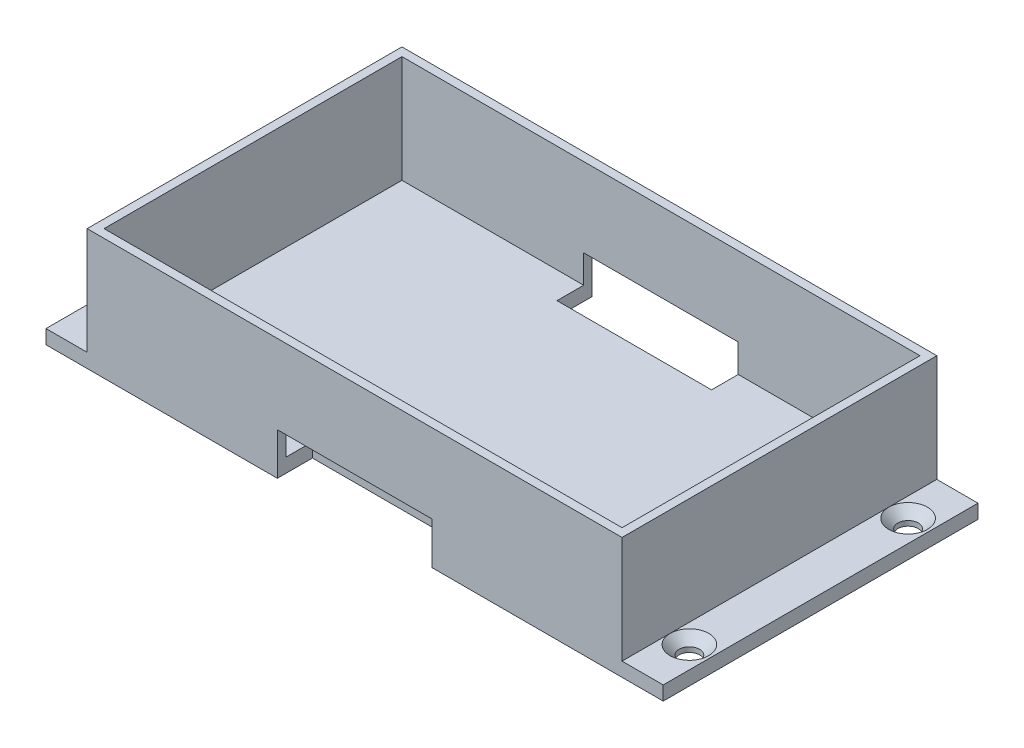
ISO-10303-21;
HEADER;
FILE_DESCRIPTION(('STEP AP214'),'2;1');
FILE_NAME('part.step','',(''),(''),'','','');
FILE_SCHEMA(('AUTOMOTIVE_DESIGN { 1 0 10303 214 1 1 1 1 }'));
ENDSEC;
DATA;
#1=APPLICATION_CONTEXT('core data for automotive mechanical design processes');
#2=APPLICATION_PROTOCOL_DEFINITION('international standard','automotive_design',2000,#1);
#3=PRODUCT_CONTEXT('',#1,'mechanical');
#4=PRODUCT('Part','Part','',(#3));
#5=PRODUCT_RELATED_PRODUCT_CATEGORY('part','',(#4));
#6=PRODUCT_DEFINITION_FORMATION('','',#4);
#7=PRODUCT_DEFINITION_CONTEXT('part definition',#1,'design');
#8=PRODUCT_DEFINITION('design','',#6,#7);
#9=PRODUCT_DEFINITION_SHAPE('','',#8);
#10=(LENGTH_UNIT() NAMED_UNIT(*) SI_UNIT(.MILLI.,.METRE.));
#11=(NAMED_UNIT(*) PLANE_ANGLE_UNIT() SI_UNIT($,.RADIAN.));
#12=(NAMED_UNIT(*) SI_UNIT($,.STERADIAN.) SOLID_ANGLE_UNIT());
#13=UNCERTAINTY_MEASURE_WITH_UNIT(LENGTH_MEASURE(1.E-05),#10,'distance_accuracy_value','');
#14=(GEOMETRIC_REPRESENTATION_CONTEXT(3) GLOBAL_UNCERTAINTY_ASSIGNED_CONTEXT((#13)) GLOBAL_UNIT_ASSIGNED_CONTEXT((#10,
#11,#12)) REPRESENTATION_CONTEXT('',''));
#15=CARTESIAN_POINT('',(0.,0.,0.));
#16=DIRECTION('',(0.,0.,1.));
#17=DIRECTION('',(1.,0.,0.));
#18=AXIS2_PLACEMENT_3D('',#15,#16,#17);
#19=CARTESIAN_POINT('',(-43.93,2.,-22.405));
#20=DIRECTION('',(0.,0.,1.));
#21=DIRECTION('',(1.,0.,0.));
#22=AXIS2_PLACEMENT_3D('',#19,#20,#21);
#23=PLANE('',#22);
#24=DIRECTION('',(0.,1.,0.));
#25=VECTOR('',#24,1.);
#26=CARTESIAN_POINT('',(-11.,2.,-22.405));
#27=LINE('',#26,#25);
#28=CARTESIAN_POINT('',(-11.,0.,-22.405));
#29=VERTEX_POINT('',#28);
#30=CARTESIAN_POINT('',(-11.,6.,-22.405));
#31=VERTEX_POINT('',#30);
#32=EDGE_CURVE('E268',#29,#31,#27,.T.);
#33=ORIENTED_EDGE('',*,*,#32,.F.);
#34=DIRECTION('',(-1.,0.,0.));
#35=VECTOR('',#34,1.);
#36=CARTESIAN_POINT('',(-43.93,0.,-22.405));
#37=LINE('',#36,#35);
#38=CARTESIAN_POINT('',(-43.93,0.,-22.405));
#39=VERTEX_POINT('',#38);
#40=EDGE_CURVE('E395',#29,#39,#37,.T.);
#41=ORIENTED_EDGE('',*,*,#40,.T.);
#42=DIRECTION('',(0.,-1.,0.));
#43=VECTOR('',#42,1.);
#44=CARTESIAN_POINT('',(-43.93,2.,-22.405));
#45=LINE('',#44,#43);
#46=CARTESIAN_POINT('',(-43.93,2.,-22.405));
#47=VERTEX_POINT('',#46);
#48=EDGE_CURVE('E409',#47,#39,#45,.T.);
#49=ORIENTED_EDGE('',*,*,#48,.F.);
#50=DIRECTION('',(-1.,0.,0.));
#51=VECTOR('',#50,1.);
#52=CARTESIAN_POINT('',(-43.93,2.,-22.405));
#53=LINE('',#52,#51);
#54=CARTESIAN_POINT('',(-38.07,2.,-22.405));
#55=VERTEX_POINT('',#54);
#56=EDGE_CURVE('E383',#55,#47,#53,.T.);
#57=ORIENTED_EDGE('',*,*,#56,.F.);
#58=DIRECTION('',(0.,-1.,0.));
#59=VECTOR('',#58,1.);
#60=CARTESIAN_POINT('',(-38.07,17.25,-22.405));
#61=LINE('',#60,#59);
#62=CARTESIAN_POINT('',(-38.07,17.25,-22.405));
#63=VERTEX_POINT('',#62);
#64=EDGE_CURVE('E331',#63,#55,#61,.T.);
#65=ORIENTED_EDGE('',*,*,#64,.F.);
#66=DIRECTION('',(-1.,0.,0.));
#67=VECTOR('',#66,1.);
#68=CARTESIAN_POINT('',(-38.07,17.25,-22.405));
#69=LINE('',#68,#67);
#70=CARTESIAN_POINT('',(38.07,17.25,-22.405));
#71=VERTEX_POINT('',#70);
#72=EDGE_CURVE('E328',#71,#63,#69,.T.);
#73=ORIENTED_EDGE('',*,*,#72,.F.);
#74=DIRECTION('',(0.,-1.,0.));
#75=VECTOR('',#74,1.);
#76=CARTESIAN_POINT('',(38.07,17.25,-22.405));
#77=LINE('',#76,#75);
#78=CARTESIAN_POINT('',(38.07,2.,-22.405));
#79=VERTEX_POINT('',#78);
#80=EDGE_CURVE('E293',#71,#79,#77,.T.);
#81=ORIENTED_EDGE('',*,*,#80,.T.);
#82=CARTESIAN_POINT('',(43.93,2.,-22.405));
#83=VERTEX_POINT('',#82);
#84=EDGE_CURVE('E385',#83,#79,#53,.T.);
#85=ORIENTED_EDGE('',*,*,#84,.F.);
#86=DIRECTION('',(0.,-1.,0.));
#87=VECTOR('',#86,1.);
#88=CARTESIAN_POINT('',(43.93,2.,-22.405));
#89=LINE('',#88,#87);
#90=CARTESIAN_POINT('',(43.93,0.,-22.405));
#91=VERTEX_POINT('',#90);
#92=EDGE_CURVE('E412',#83,#91,#89,.T.);
#93=ORIENTED_EDGE('',*,*,#92,.T.);
#94=CARTESIAN_POINT('',(11.,0.,-22.405));
#95=VERTEX_POINT('',#94);
#96=EDGE_CURVE('E396',#91,#95,#37,.T.);
#97=ORIENTED_EDGE('',*,*,#96,.T.);
#98=DIRECTION('',(0.,-1.,0.));
#99=VECTOR('',#98,1.);
#100=CARTESIAN_POINT('',(11.,2.,-22.405));
#101=LINE('',#100,#99);
#102=CARTESIAN_POINT('',(11.,6.,-22.405));
#103=VERTEX_POINT('',#102);
#104=EDGE_CURVE('E280',#103,#95,#101,.T.);
#105=ORIENTED_EDGE('',*,*,#104,.F.);
#106=DIRECTION('',(1.,0.,0.));
#107=VECTOR('',#106,1.);
#108=CARTESIAN_POINT('',(-43.93,6.,-22.405));
#109=LINE('',#108,#107);
#110=EDGE_CURVE('E274',#31,#103,#109,.T.);
#111=ORIENTED_EDGE('',*,*,#110,.F.);
#112=EDGE_LOOP('',(#33,#41,#49,#57,#65,#73,#81,#85,#93,#97,#105,#111));
#113=FACE_BOUND('',#112,.T.);
#114=ADVANCED_FACE('F39',(#113),#23,.F.);
#115=CARTESIAN_POINT('',(-43.93,2.,22.405));
#116=DIRECTION('',(0.,0.,-1.));
#117=DIRECTION('',(-1.,0.,0.));
#118=AXIS2_PLACEMENT_3D('',#115,#116,#117);
#119=PLANE('',#118);
#120=DIRECTION('',(1.,0.,0.));
#121=VECTOR('',#120,1.);
#122=CARTESIAN_POINT('',(-43.93,0.,22.405));
#123=LINE('',#122,#121);
#124=CARTESIAN_POINT('',(-43.93,0.,22.405));
#125=VERTEX_POINT('',#124);
#126=CARTESIAN_POINT('',(-11.,0.,22.405));
#127=VERTEX_POINT('',#126);
#128=EDGE_CURVE('E384',#125,#127,#123,.T.);
#129=ORIENTED_EDGE('',*,*,#128,.T.);
#130=DIRECTION('',(0.,-1.,0.));
#131=VECTOR('',#130,1.);
#132=CARTESIAN_POINT('',(-11.,2.,22.405));
#133=LINE('',#132,#131);
#134=CARTESIAN_POINT('',(-11.,6.,22.405));
#135=VERTEX_POINT('',#134);
#136=EDGE_CURVE('E266',#135,#127,#133,.T.);
#137=ORIENTED_EDGE('',*,*,#136,.F.);
#138=DIRECTION('',(-1.,0.,0.));
#139=VECTOR('',#138,1.);
#140=CARTESIAN_POINT('',(-43.93,6.,22.405));
#141=LINE('',#140,#139);
#142=CARTESIAN_POINT('',(11.,6.,22.405));
#143=VERTEX_POINT('',#142);
#144=EDGE_CURVE('E272',#143,#135,#141,.T.);
#145=ORIENTED_EDGE('',*,*,#144,.F.);
#146=DIRECTION('',(0.,1.,0.));
#147=VECTOR('',#146,1.);
#148=CARTESIAN_POINT('',(11.,2.,22.405));
#149=LINE('',#148,#147);
#150=CARTESIAN_POINT('',(11.,0.,22.405));
#151=VERTEX_POINT('',#150);
#152=EDGE_CURVE('E278',#151,#143,#149,.T.);
#153=ORIENTED_EDGE('',*,*,#152,.F.);
#154=CARTESIAN_POINT('',(43.93,0.,22.405));
#155=VERTEX_POINT('',#154);
#156=EDGE_CURVE('E401',#151,#155,#123,.T.);
#157=ORIENTED_EDGE('',*,*,#156,.T.);
#158=DIRECTION('',(0.,-1.,0.));
#159=VECTOR('',#158,1.);
#160=CARTESIAN_POINT('',(43.93,2.,22.405));
#161=LINE('',#160,#159);
#162=CARTESIAN_POINT('',(43.93,2.,22.405));
#163=VERTEX_POINT('',#162);
#164=EDGE_CURVE('E392',#163,#155,#161,.T.);
#165=ORIENTED_EDGE('',*,*,#164,.F.);
#166=DIRECTION('',(1.,0.,0.));
#167=VECTOR('',#166,1.);
#168=CARTESIAN_POINT('',(-43.93,2.,22.405));
#169=LINE('',#168,#167);
#170=CARTESIAN_POINT('',(38.07,2.,22.405));
#171=VERTEX_POINT('',#170);
#172=EDGE_CURVE('E390',#171,#163,#169,.T.);
#173=ORIENTED_EDGE('',*,*,#172,.F.);
#174=DIRECTION('',(0.,-1.,0.));
#175=VECTOR('',#174,1.);
#176=CARTESIAN_POINT('',(38.07,17.25,22.405));
#177=LINE('',#176,#175);
#178=CARTESIAN_POINT('',(38.07,17.25,22.405));
#179=VERTEX_POINT('',#178);
#180=EDGE_CURVE('E307',#179,#171,#177,.T.);
#181=ORIENTED_EDGE('',*,*,#180,.F.);
#182=DIRECTION('',(1.,0.,0.));
#183=VECTOR('',#182,1.);
#184=CARTESIAN_POINT('',(-36.87,17.25,22.405));
#185=LINE('',#184,#183);
#186=CARTESIAN_POINT('',(-38.07,17.25,22.405));
#187=VERTEX_POINT('',#186);
#188=EDGE_CURVE('E322',#187,#179,#185,.T.);
#189=ORIENTED_EDGE('',*,*,#188,.F.);
#190=DIRECTION('',(0.,-1.,0.));
#191=VECTOR('',#190,1.);
#192=CARTESIAN_POINT('',(-38.07,17.25,22.405));
#193=LINE('',#192,#191);
#194=CARTESIAN_POINT('',(-38.07,2.,22.405));
#195=VERTEX_POINT('',#194);
#196=EDGE_CURVE('E340',#187,#195,#193,.T.);
#197=ORIENTED_EDGE('',*,*,#196,.T.);
#198=CARTESIAN_POINT('',(-43.93,2.,22.405));
#199=VERTEX_POINT('',#198);
#200=EDGE_CURVE('E62',#199,#195,#169,.T.);
#201=ORIENTED_EDGE('',*,*,#200,.F.);
#202=DIRECTION('',(0.,-1.,0.));
#203=VECTOR('',#202,1.);
#204=CARTESIAN_POINT('',(-43.93,2.,22.405));
#205=LINE('',#204,#203);
#206=EDGE_CURVE('E406',#199,#125,#205,.T.);
#207=ORIENTED_EDGE('',*,*,#206,.T.);
#208=EDGE_LOOP('',(#129,#137,#145,#153,#157,#165,#173,#181,#189,#197,#201,#207));
#209=FACE_BOUND('',#208,.T.);
#210=ADVANCED_FACE('F445',(#209),#119,.F.);
#211=CARTESIAN_POINT('',(36.87,17.25,-21.205));
#212=DIRECTION('',(0.,0.,-1.));
#213=DIRECTION('',(-1.,0.,0.));
#214=AXIS2_PLACEMENT_3D('',#211,#212,#213);
#215=PLANE('',#214);
#216=DIRECTION('',(0.,1.,0.));
#217=VECTOR('',#216,1.);
#218=CARTESIAN_POINT('',(11.,17.25,-21.205));
#219=LINE('',#218,#217);
#220=CARTESIAN_POINT('',(11.,2.,-21.205));
#221=VERTEX_POINT('',#220);
#222=CARTESIAN_POINT('',(11.,6.,-21.205));
#223=VERTEX_POINT('',#222);
#224=EDGE_CURVE('E276',#221,#223,#219,.T.);
#225=ORIENTED_EDGE('',*,*,#224,.F.);
#226=DIRECTION('',(1.,0.,0.));
#227=VECTOR('',#226,1.);
#228=CARTESIAN_POINT('',(36.87,2.,-21.205));
#229=LINE('',#228,#227);
#230=CARTESIAN_POINT('',(36.87,2.,-21.205));
#231=VERTEX_POINT('',#230);
#232=EDGE_CURVE('E282',#221,#231,#229,.T.);
#233=ORIENTED_EDGE('',*,*,#232,.T.);
#234=DIRECTION('',(0.,-1.,0.));
#235=VECTOR('',#234,1.);
#236=CARTESIAN_POINT('',(36.87,17.25,-21.205));
#237=LINE('',#236,#235);
#238=CARTESIAN_POINT('',(36.87,17.25,-21.205));
#239=VERTEX_POINT('',#238);
#240=EDGE_CURVE('E313',#239,#231,#237,.T.);
#241=ORIENTED_EDGE('',*,*,#240,.F.);
#242=DIRECTION('',(1.,0.,0.));
#243=VECTOR('',#242,1.);
#244=CARTESIAN_POINT('',(36.87,17.25,-21.205));
#245=LINE('',#244,#243);
#246=CARTESIAN_POINT('',(-36.87,17.25,-21.205));
#247=VERTEX_POINT('',#246);
#248=EDGE_CURVE('E283',#247,#239,#245,.T.);
#249=ORIENTED_EDGE('',*,*,#248,.F.);
#250=DIRECTION('',(0.,-1.,0.));
#251=VECTOR('',#250,1.);
#252=CARTESIAN_POINT('',(-36.87,17.25,-21.205));
#253=LINE('',#252,#251);
#254=CARTESIAN_POINT('',(-36.87,2.,-21.205));
#255=VERTEX_POINT('',#254);
#256=EDGE_CURVE('E316',#247,#255,#253,.T.);
#257=ORIENTED_EDGE('',*,*,#256,.T.);
#258=CARTESIAN_POINT('',(-11.,2.,-21.205));
#259=VERTEX_POINT('',#258);
#260=EDGE_CURVE('E294',#255,#259,#229,.T.);
#261=ORIENTED_EDGE('',*,*,#260,.T.);
#262=DIRECTION('',(0.,-1.,0.));
#263=VECTOR('',#262,1.);
#264=CARTESIAN_POINT('',(-11.,17.25,-21.205));
#265=LINE('',#264,#263);
#266=CARTESIAN_POINT('',(-11.,6.,-21.205));
#267=VERTEX_POINT('',#266);
#268=EDGE_CURVE('E263',#267,#259,#265,.T.);
#269=ORIENTED_EDGE('',*,*,#268,.F.);
#270=DIRECTION('',(-1.,0.,0.));
#271=VECTOR('',#270,1.);
#272=CARTESIAN_POINT('',(36.87,6.,-21.205));
#273=LINE('',#272,#271);
#274=EDGE_CURVE('E270',#223,#267,#273,.T.);
#275=ORIENTED_EDGE('',*,*,#274,.F.);
#276=EDGE_LOOP('',(#225,#233,#241,#249,#257,#261,#269,#275));
#277=FACE_BOUND('',#276,.T.);
#278=ADVANCED_FACE('F460',(#277),#215,.F.);
#279=CARTESIAN_POINT('',(-36.87,17.25,21.205));
#280=DIRECTION('',(0.,0.,1.));
#281=DIRECTION('',(1.,0.,0.));
#282=AXIS2_PLACEMENT_3D('',#279,#280,#281);
#283=PLANE('',#282);
#284=DIRECTION('',(0.,-1.,0.));
#285=VECTOR('',#284,1.);
#286=CARTESIAN_POINT('',(11.,17.25,21.205));
#287=LINE('',#286,#285);
#288=CARTESIAN_POINT('',(11.,6.,21.205));
#289=VERTEX_POINT('',#288);
#290=CARTESIAN_POINT('',(11.,2.,21.205));
#291=VERTEX_POINT('',#290);
#292=EDGE_CURVE('E231',#289,#291,#287,.T.);
#293=ORIENTED_EDGE('',*,*,#292,.F.);
#294=DIRECTION('',(1.,0.,0.));
#295=VECTOR('',#294,1.);
#296=CARTESIAN_POINT('',(-36.87,6.,21.205));
#297=LINE('',#296,#295);
#298=CARTESIAN_POINT('',(-11.,6.,21.205));
#299=VERTEX_POINT('',#298);
#300=EDGE_CURVE('E417',#299,#289,#297,.T.);
#301=ORIENTED_EDGE('',*,*,#300,.F.);
#302=DIRECTION('',(0.,1.,0.));
#303=VECTOR('',#302,1.);
#304=CARTESIAN_POINT('',(-11.,17.25,21.205));
#305=LINE('',#304,#303);
#306=CARTESIAN_POINT('',(-11.,2.,21.205));
#307=VERTEX_POINT('',#306);
#308=EDGE_CURVE('E415',#307,#299,#305,.T.);
#309=ORIENTED_EDGE('',*,*,#308,.F.);
#310=DIRECTION('',(-1.,0.,0.));
#311=VECTOR('',#310,1.);
#312=CARTESIAN_POINT('',(-36.87,2.,21.205));
#313=LINE('',#312,#311);
#314=CARTESIAN_POINT('',(-36.87,2.,21.205));
#315=VERTEX_POINT('',#314);
#316=EDGE_CURVE('E299',#307,#315,#313,.T.);
#317=ORIENTED_EDGE('',*,*,#316,.T.);
#318=DIRECTION('',(0.,-1.,0.));
#319=VECTOR('',#318,1.);
#320=CARTESIAN_POINT('',(-36.87,17.25,21.205));
#321=LINE('',#320,#319);
#322=CARTESIAN_POINT('',(-36.87,17.25,21.205));
#323=VERTEX_POINT('',#322);
#324=EDGE_CURVE('E54',#323,#315,#321,.T.);
#325=ORIENTED_EDGE('',*,*,#324,.F.);
#326=DIRECTION('',(-1.,0.,0.));
#327=VECTOR('',#326,1.);
#328=CARTESIAN_POINT('',(-36.87,17.25,21.205));
#329=LINE('',#328,#327);
#330=CARTESIAN_POINT('',(36.87,17.25,21.205));
#331=VERTEX_POINT('',#330);
#332=EDGE_CURVE('E288',#331,#323,#329,.T.);
#333=ORIENTED_EDGE('',*,*,#332,.F.);
#334=DIRECTION('',(0.,-1.,0.));
#335=VECTOR('',#334,1.);
#336=CARTESIAN_POINT('',(36.87,17.25,21.205));
#337=LINE('',#336,#335);
#338=CARTESIAN_POINT('',(36.87,2.,21.205));
#339=VERTEX_POINT('',#338);
#340=EDGE_CURVE('E310',#331,#339,#337,.T.);
#341=ORIENTED_EDGE('',*,*,#340,.T.);
#342=EDGE_CURVE('E300',#339,#291,#313,.T.);
#343=ORIENTED_EDGE('',*,*,#342,.T.);
#344=EDGE_LOOP('',(#293,#301,#309,#317,#325,#333,#341,#343));
#345=FACE_BOUND('',#344,.T.);
#346=ADVANCED_FACE('F449',(#345),#283,.F.);
#347=CARTESIAN_POINT('',(0.,2.,0.));
#348=DIRECTION('',(0.,1.,0.));
#349=DIRECTION('',(0.,0.,1.));
#350=AXIS2_PLACEMENT_3D('',#347,#348,#349);
#351=PLANE('',#350);
#352=DIRECTION('',(0.,0.,1.));
#353=VECTOR('',#352,1.);
#354=CARTESIAN_POINT('',(-11.,2.,17.405));
#355=LINE('',#354,#353);
#356=CARTESIAN_POINT('',(-11.,2.,17.405));
#357=VERTEX_POINT('',#356);
#358=EDGE_CURVE('E235',#357,#307,#355,.T.);
#359=ORIENTED_EDGE('',*,*,#358,.F.);
#360=DIRECTION('',(-1.,0.,0.));
#361=VECTOR('',#360,1.);
#362=CARTESIAN_POINT('',(11.,2.,17.405));
#363=LINE('',#362,#361);
#364=CARTESIAN_POINT('',(11.,2.,17.405));
#365=VERTEX_POINT('',#364);
#366=EDGE_CURVE('E218',#365,#357,#363,.T.);
#367=ORIENTED_EDGE('',*,*,#366,.F.);
#368=DIRECTION('',(0.,0.,-1.));
#369=VECTOR('',#368,1.);
#370=CARTESIAN_POINT('',(11.,2.,22.405));
#371=LINE('',#370,#369);
#372=EDGE_CURVE('E227',#291,#365,#371,.T.);
#373=ORIENTED_EDGE('',*,*,#372,.F.);
#374=ORIENTED_EDGE('',*,*,#342,.F.);
#375=DIRECTION('',(0.,0.,1.));
#376=VECTOR('',#375,1.);
#377=CARTESIAN_POINT('',(36.87,2.,21.205));
#378=LINE('',#377,#376);
#379=EDGE_CURVE('E297',#231,#339,#378,.T.);
#380=ORIENTED_EDGE('',*,*,#379,.F.);
#381=ORIENTED_EDGE('',*,*,#232,.F.);
#382=DIRECTION('',(0.,0.,-1.));
#383=VECTOR('',#382,1.);
#384=CARTESIAN_POINT('',(11.,2.,-22.405));
#385=LINE('',#384,#383);
#386=CARTESIAN_POINT('',(11.,2.,-17.405));
#387=VERTEX_POINT('',#386);
#388=EDGE_CURVE('E246',#387,#221,#385,.T.);
#389=ORIENTED_EDGE('',*,*,#388,.F.);
#390=DIRECTION('',(1.,0.,0.));
#391=VECTOR('',#390,1.);
#392=CARTESIAN_POINT('',(11.,2.,-17.405));
#393=LINE('',#392,#391);
#394=CARTESIAN_POINT('',(-11.,2.,-17.405));
#395=VERTEX_POINT('',#394);
#396=EDGE_CURVE('E242',#395,#387,#393,.T.);
#397=ORIENTED_EDGE('',*,*,#396,.F.);
#398=DIRECTION('',(0.,0.,1.));
#399=VECTOR('',#398,1.);
#400=CARTESIAN_POINT('',(-11.,2.,-21.205));
#401=LINE('',#400,#399);
#402=EDGE_CURVE('E248',#259,#395,#401,.T.);
#403=ORIENTED_EDGE('',*,*,#402,.F.);
#404=ORIENTED_EDGE('',*,*,#260,.F.);
#405=DIRECTION('',(0.,0.,-1.));
#406=VECTOR('',#405,1.);
#407=CARTESIAN_POINT('',(-36.87,2.,-22.405));
#408=LINE('',#407,#406);
#409=EDGE_CURVE('E318',#315,#255,#408,.T.);
#410=ORIENTED_EDGE('',*,*,#409,.F.);
#411=ORIENTED_EDGE('',*,*,#316,.F.);
#412=EDGE_LOOP('',(#359,#367,#373,#374,#380,#381,#389,#397,#403,#404,#410,#411));
#413=FACE_BOUND('',#412,.T.);
#414=ADVANCED_FACE('F237',(#413),#351,.T.);
#415=ORIENTED_EDGE('',*,*,#84,.T.);
#416=DIRECTION('',(0.,0.,-1.));
#417=VECTOR('',#416,1.);
#418=CARTESIAN_POINT('',(38.07,2.,-22.405));
#419=LINE('',#418,#417);
#420=CARTESIAN_POINT('',(38.07,2.,-15.565));
#421=VERTEX_POINT('',#420);
#422=EDGE_CURVE('E302',#421,#79,#419,.T.);
#423=ORIENTED_EDGE('',*,*,#422,.F.);
#424=CARTESIAN_POINT('',(40.82,2.,-15.565));
#425=DIRECTION('',(0.,1.,0.));
#426=DIRECTION('',(0.,0.,1.));
#427=AXIS2_PLACEMENT_3D('',#424,#425,#426);
#428=CIRCLE('',#427,2.75);
#429=EDGE_CURVE('E370',#421,#421,#428,.T.);
#430=ORIENTED_EDGE('',*,*,#429,.F.);
#431=CARTESIAN_POINT('',(38.07,2.,15.565));
#432=VERTEX_POINT('',#431);
#433=EDGE_CURVE('E304',#432,#421,#419,.T.);
#434=ORIENTED_EDGE('',*,*,#433,.F.);
#435=CARTESIAN_POINT('',(40.82,2.,15.565));
#436=DIRECTION('',(0.,1.,0.));
#437=DIRECTION('',(0.,0.,1.));
#438=AXIS2_PLACEMENT_3D('',#435,#436,#437);
#439=CIRCLE('',#438,2.75);
#440=EDGE_CURVE('E361',#432,#432,#439,.T.);
#441=ORIENTED_EDGE('',*,*,#440,.F.);
#442=EDGE_CURVE('E286',#171,#432,#419,.T.);
#443=ORIENTED_EDGE('',*,*,#442,.F.);
#444=ORIENTED_EDGE('',*,*,#172,.T.);
#445=DIRECTION('',(0.,0.,-1.));
#446=VECTOR('',#445,1.);
#447=CARTESIAN_POINT('',(43.93,2.,-22.405));
#448=LINE('',#447,#446);
#449=EDGE_CURVE('E380',#163,#83,#448,.T.);
#450=ORIENTED_EDGE('',*,*,#449,.T.);
#451=EDGE_LOOP('',(#415,#423,#430,#434,#441,#443,#444,#450));
#452=FACE_BOUND('',#451,.T.);
#453=ADVANCED_FACE('F507',(#452),#351,.T.);
#454=CARTESIAN_POINT('',(-36.87,17.25,-22.405));
#455=DIRECTION('',(-1.,0.,0.));
#456=DIRECTION('',(0.,0.,1.));
#457=AXIS2_PLACEMENT_3D('',#454,#455,#456);
#458=PLANE('',#457);
#459=ORIENTED_EDGE('',*,*,#256,.F.);
#460=DIRECTION('',(0.,0.,-1.));
#461=VECTOR('',#460,1.);
#462=CARTESIAN_POINT('',(-36.87,17.25,-22.405));
#463=LINE('',#462,#461);
#464=EDGE_CURVE('E325',#323,#247,#463,.T.);
#465=ORIENTED_EDGE('',*,*,#464,.F.);
#466=ORIENTED_EDGE('',*,*,#324,.T.);
#467=ORIENTED_EDGE('',*,*,#409,.T.);
#468=EDGE_LOOP('',(#459,#465,#466,#467));
#469=FACE_BOUND('',#468,.T.);
#470=ADVANCED_FACE('F485',(#469),#458,.F.);
#471=DIRECTION('',(0.,0.,1.));
#472=VECTOR('',#471,1.);
#473=CARTESIAN_POINT('',(-38.07,2.,-15.565));
#474=LINE('',#473,#472);
#475=CARTESIAN_POINT('',(-38.07,2.,-15.565));
#476=VERTEX_POINT('',#475);
#477=EDGE_CURVE('E323',#55,#476,#474,.T.);
#478=ORIENTED_EDGE('',*,*,#477,.F.);
#479=ORIENTED_EDGE('',*,*,#56,.T.);
#480=DIRECTION('',(0.,0.,1.));
#481=VECTOR('',#480,1.);
#482=CARTESIAN_POINT('',(-43.93,2.,-22.405));
#483=LINE('',#482,#481);
#484=EDGE_CURVE('E388',#47,#199,#483,.T.);
#485=ORIENTED_EDGE('',*,*,#484,.T.);
#486=ORIENTED_EDGE('',*,*,#200,.T.);
#487=CARTESIAN_POINT('',(-38.07,2.,15.565));
#488=VERTEX_POINT('',#487);
#489=EDGE_CURVE('E337',#488,#195,#474,.T.);
#490=ORIENTED_EDGE('',*,*,#489,.F.);
#491=CARTESIAN_POINT('',(-40.82,2.,15.565));
#492=DIRECTION('',(0.,1.,0.));
#493=DIRECTION('',(0.,0.,1.));
#494=AXIS2_PLACEMENT_3D('',#491,#492,#493);
#495=CIRCLE('',#494,2.75);
#496=EDGE_CURVE('E352',#488,#488,#495,.T.);
#497=ORIENTED_EDGE('',*,*,#496,.F.);
#498=EDGE_CURVE('E336',#476,#488,#474,.T.);
#499=ORIENTED_EDGE('',*,*,#498,.F.);
#500=CARTESIAN_POINT('',(-40.82,2.,-15.565));
#501=DIRECTION('',(0.,1.,0.));
#502=DIRECTION('',(0.,0.,1.));
#503=AXIS2_PLACEMENT_3D('',#500,#501,#502);
#504=CIRCLE('',#503,2.75);
#505=EDGE_CURVE('E343',#476,#476,#504,.T.);
#506=ORIENTED_EDGE('',*,*,#505,.F.);
#507=EDGE_LOOP('',(#478,#479,#485,#486,#490,#497,#499,#506));
#508=FACE_BOUND('',#507,.T.);
#509=ADVANCED_FACE('F514',(#508),#351,.T.);
#510=CARTESIAN_POINT('',(43.93,2.,-22.405));
#511=DIRECTION('',(-1.,0.,0.));
#512=DIRECTION('',(0.,0.,1.));
#513=AXIS2_PLACEMENT_3D('',#510,#511,#512);
#514=PLANE('',#513);
#515=DIRECTION('',(0.,0.,-1.));
#516=VECTOR('',#515,1.);
#517=CARTESIAN_POINT('',(43.93,0.,-22.405));
#518=LINE('',#517,#516);
#519=EDGE_CURVE('E379',#155,#91,#518,.T.);
#520=ORIENTED_EDGE('',*,*,#519,.T.);
#521=ORIENTED_EDGE('',*,*,#92,.F.);
#522=ORIENTED_EDGE('',*,*,#449,.F.);
#523=ORIENTED_EDGE('',*,*,#164,.T.);
#524=EDGE_LOOP('',(#520,#521,#522,#523));
#525=FACE_BOUND('',#524,.T.);
#526=ADVANCED_FACE('F41',(#525),#514,.F.);
#527=CARTESIAN_POINT('',(-43.93,2.,-22.405));
#528=DIRECTION('',(1.,0.,0.));
#529=DIRECTION('',(0.,0.,-1.));
#530=AXIS2_PLACEMENT_3D('',#527,#528,#529);
#531=PLANE('',#530);
#532=DIRECTION('',(0.,0.,1.));
#533=VECTOR('',#532,1.);
#534=CARTESIAN_POINT('',(-43.93,0.,-22.405));
#535=LINE('',#534,#533);
#536=EDGE_CURVE('E399',#39,#125,#535,.T.);
#537=ORIENTED_EDGE('',*,*,#536,.T.);
#538=ORIENTED_EDGE('',*,*,#206,.F.);
#539=ORIENTED_EDGE('',*,*,#484,.F.);
#540=ORIENTED_EDGE('',*,*,#48,.T.);
#541=EDGE_LOOP('',(#537,#538,#539,#540));
#542=FACE_BOUND('',#541,.T.);
#543=ADVANCED_FACE('F513',(#542),#531,.F.);
#544=CARTESIAN_POINT('',(0.,0.,0.));
#545=DIRECTION('',(0.,1.,0.));
#546=DIRECTION('',(0.,0.,1.));
#547=AXIS2_PLACEMENT_3D('',#544,#545,#546);
#548=PLANE('',#547);
#549=DIRECTION('',(-1.,0.,0.));
#550=VECTOR('',#549,1.);
#551=CARTESIAN_POINT('',(0.,0.,17.405));
#552=LINE('',#551,#550);
#553=CARTESIAN_POINT('',(11.,0.,17.405));
#554=VERTEX_POINT('',#553);
#555=CARTESIAN_POINT('',(-11.,0.,17.405));
#556=VERTEX_POINT('',#555);
#557=EDGE_CURVE('E47',#554,#556,#552,.T.);
#558=ORIENTED_EDGE('',*,*,#557,.T.);
#559=DIRECTION('',(0.,0.,1.));
#560=VECTOR('',#559,1.);
#561=CARTESIAN_POINT('',(-11.,0.,0.));
#562=LINE('',#561,#560);
#563=EDGE_CURVE('E11',#556,#127,#562,.T.);
#564=ORIENTED_EDGE('',*,*,#563,.T.);
#565=ORIENTED_EDGE('',*,*,#128,.F.);
#566=ORIENTED_EDGE('',*,*,#536,.F.);
#567=ORIENTED_EDGE('',*,*,#40,.F.);
#568=DIRECTION('',(0.,0.,1.));
#569=VECTOR('',#568,1.);
#570=CARTESIAN_POINT('',(-11.,0.,0.));
#571=LINE('',#570,#569);
#572=CARTESIAN_POINT('',(-11.,0.,-17.405));
#573=VERTEX_POINT('',#572);
#574=EDGE_CURVE('E426',#29,#573,#571,.T.);
#575=ORIENTED_EDGE('',*,*,#574,.T.);
#576=DIRECTION('',(1.,0.,0.));
#577=VECTOR('',#576,1.);
#578=CARTESIAN_POINT('',(0.,0.,-17.405));
#579=LINE('',#578,#577);
#580=CARTESIAN_POINT('',(11.,0.,-17.405));
#581=VERTEX_POINT('',#580);
#582=EDGE_CURVE('E420',#573,#581,#579,.T.);
#583=ORIENTED_EDGE('',*,*,#582,.T.);
#584=DIRECTION('',(0.,0.,-1.));
#585=VECTOR('',#584,1.);
#586=CARTESIAN_POINT('',(11.,0.,0.));
#587=LINE('',#586,#585);
#588=EDGE_CURVE('E423',#581,#95,#587,.T.);
#589=ORIENTED_EDGE('',*,*,#588,.T.);
#590=ORIENTED_EDGE('',*,*,#96,.F.);
#591=ORIENTED_EDGE('',*,*,#519,.F.);
#592=ORIENTED_EDGE('',*,*,#156,.F.);
#593=DIRECTION('',(0.,0.,-1.));
#594=VECTOR('',#593,1.);
#595=CARTESIAN_POINT('',(11.,0.,0.));
#596=LINE('',#595,#594);
#597=EDGE_CURVE('E429',#151,#554,#596,.T.);
#598=ORIENTED_EDGE('',*,*,#597,.T.);
#599=EDGE_LOOP('',(#558,#564,#565,#566,#567,#575,#583,#589,#590,#591,#592,#598));
#600=FACE_BOUND('',#599,.T.);
#601=CARTESIAN_POINT('',(-40.82,0.,-15.565));
#602=DIRECTION('',(0.,1.,0.));
#603=DIRECTION('',(0.,0.,1.));
#604=AXIS2_PLACEMENT_3D('',#601,#602,#603);
#605=CIRCLE('',#604,1.45);
#606=CARTESIAN_POINT('',(-40.82,0.,-14.115));
#607=VERTEX_POINT('',#606);
#608=EDGE_CURVE('E349',#607,#607,#605,.T.);
#609=ORIENTED_EDGE('',*,*,#608,.T.);
#610=EDGE_LOOP('',(#609));
#611=FACE_BOUND('',#610,.T.);
#612=CARTESIAN_POINT('',(-40.82,0.,15.565));
#613=DIRECTION('',(0.,1.,0.));
#614=DIRECTION('',(0.,0.,1.));
#615=AXIS2_PLACEMENT_3D('',#612,#613,#614);
#616=CIRCLE('',#615,1.45);
#617=CARTESIAN_POINT('',(-40.82,0.,17.015));
#618=VERTEX_POINT('',#617);
#619=EDGE_CURVE('E358',#618,#618,#616,.T.);
#620=ORIENTED_EDGE('',*,*,#619,.T.);
#621=EDGE_LOOP('',(#620));
#622=FACE_BOUND('',#621,.T.);
#623=CARTESIAN_POINT('',(40.82,0.,15.565));
#624=DIRECTION('',(0.,1.,0.));
#625=DIRECTION('',(0.,0.,1.));
#626=AXIS2_PLACEMENT_3D('',#623,#624,#625);
#627=CIRCLE('',#626,1.45);
#628=CARTESIAN_POINT('',(40.82,0.,17.015));
#629=VERTEX_POINT('',#628);
#630=EDGE_CURVE('E367',#629,#629,#627,.T.);
#631=ORIENTED_EDGE('',*,*,#630,.T.);
#632=EDGE_LOOP('',(#631));
#633=FACE_BOUND('',#632,.T.);
#634=CARTESIAN_POINT('',(40.82,0.,-15.565));
#635=DIRECTION('',(0.,1.,0.));
#636=DIRECTION('',(0.,0.,1.));
#637=AXIS2_PLACEMENT_3D('',#634,#635,#636);
#638=CIRCLE('',#637,1.45);
#639=CARTESIAN_POINT('',(40.82,0.,-14.115));
#640=VERTEX_POINT('',#639);
#641=EDGE_CURVE('E376',#640,#640,#638,.T.);
#642=ORIENTED_EDGE('',*,*,#641,.T.);
#643=EDGE_LOOP('',(#642));
#644=FACE_BOUND('',#643,.T.);
#645=ADVANCED_FACE('F431',(#600,#611,#622,#633,#644),#548,.F.);
#646=CARTESIAN_POINT('',(40.82,2.,-15.565));
#647=DIRECTION('',(0.,1.,0.));
#648=DIRECTION('',(0.,0.,1.));
#649=AXIS2_PLACEMENT_3D('',#646,#647,#648);
#650=CYLINDRICAL_SURFACE('',#649,1.45);
#651=ORIENTED_EDGE('',*,*,#641,.F.);
#652=EDGE_LOOP('',(#651));
#653=FACE_BOUND('',#652,.T.);
#654=CARTESIAN_POINT('',(40.82,0.700000000000001,-15.565));
#655=DIRECTION('',(0.,1.,0.));
#656=DIRECTION('',(0.,0.,1.));
#657=AXIS2_PLACEMENT_3D('',#654,#655,#656);
#658=CIRCLE('',#657,1.45);
#659=CARTESIAN_POINT('',(40.82,0.700000000000001,-14.115));
#660=VERTEX_POINT('',#659);
#661=EDGE_CURVE('E373',#660,#660,#658,.T.);
#662=ORIENTED_EDGE('',*,*,#661,.T.);
#663=EDGE_LOOP('',(#662));
#664=FACE_BOUND('',#663,.T.);
#665=ADVANCED_FACE('F531',(#653,#664),#650,.F.);
#666=CARTESIAN_POINT('',(40.82,2.,-15.565));
#667=DIRECTION('',(0.,1.,0.));
#668=DIRECTION('',(0.,0.,1.));
#669=AXIS2_PLACEMENT_3D('',#666,#667,#668);
#670=CONICAL_SURFACE('',#669,2.75,0.78539816339745);
#671=ORIENTED_EDGE('',*,*,#661,.F.);
#672=EDGE_LOOP('',(#671));
#673=FACE_BOUND('',#672,.T.);
#674=ORIENTED_EDGE('',*,*,#429,.T.);
#675=EDGE_LOOP('',(#674));
#676=FACE_BOUND('',#675,.T.);
#677=ADVANCED_FACE('F536',(#673,#676),#670,.F.);
#678=CARTESIAN_POINT('',(40.82,2.,15.565));
#679=DIRECTION('',(0.,1.,0.));
#680=DIRECTION('',(0.,0.,1.));
#681=AXIS2_PLACEMENT_3D('',#678,#679,#680);
#682=CYLINDRICAL_SURFACE('',#681,1.45);
#683=ORIENTED_EDGE('',*,*,#630,.F.);
#684=EDGE_LOOP('',(#683));
#685=FACE_BOUND('',#684,.T.);
#686=CARTESIAN_POINT('',(40.82,0.700000000000001,15.565));
#687=DIRECTION('',(0.,1.,0.));
#688=DIRECTION('',(0.,0.,1.));
#689=AXIS2_PLACEMENT_3D('',#686,#687,#688);
#690=CIRCLE('',#689,1.45);
#691=CARTESIAN_POINT('',(40.82,0.700000000000001,17.015));
#692=VERTEX_POINT('',#691);
#693=EDGE_CURVE('E364',#692,#692,#690,.T.);
#694=ORIENTED_EDGE('',*,*,#693,.T.);
#695=EDGE_LOOP('',(#694));
#696=FACE_BOUND('',#695,.T.);
#697=ADVANCED_FACE('F540',(#685,#696),#682,.F.);
#698=CARTESIAN_POINT('',(40.82,2.,15.565));
#699=DIRECTION('',(0.,1.,0.));
#700=DIRECTION('',(0.,0.,1.));
#701=AXIS2_PLACEMENT_3D('',#698,#699,#700);
#702=CONICAL_SURFACE('',#701,2.75,0.78539816339745);
#703=ORIENTED_EDGE('',*,*,#693,.F.);
#704=EDGE_LOOP('',(#703));
#705=FACE_BOUND('',#704,.T.);
#706=ORIENTED_EDGE('',*,*,#440,.T.);
#707=EDGE_LOOP('',(#706));
#708=FACE_BOUND('',#707,.T.);
#709=ADVANCED_FACE('F544',(#705,#708),#702,.F.);
#710=CARTESIAN_POINT('',(-40.82,2.,15.565));
#711=DIRECTION('',(0.,1.,0.));
#712=DIRECTION('',(0.,0.,1.));
#713=AXIS2_PLACEMENT_3D('',#710,#711,#712);
#714=CYLINDRICAL_SURFACE('',#713,1.45);
#715=ORIENTED_EDGE('',*,*,#619,.F.);
#716=EDGE_LOOP('',(#715));
#717=FACE_BOUND('',#716,.T.);
#718=CARTESIAN_POINT('',(-40.82,0.700000000000001,15.565));
#719=DIRECTION('',(0.,1.,0.));
#720=DIRECTION('',(0.,0.,1.));
#721=AXIS2_PLACEMENT_3D('',#718,#719,#720);
#722=CIRCLE('',#721,1.45);
#723=CARTESIAN_POINT('',(-40.82,0.700000000000001,17.015));
#724=VERTEX_POINT('',#723);
#725=EDGE_CURVE('E355',#724,#724,#722,.T.);
#726=ORIENTED_EDGE('',*,*,#725,.T.);
#727=EDGE_LOOP('',(#726));
#728=FACE_BOUND('',#727,.T.);
#729=ADVANCED_FACE('F548',(#717,#728),#714,.F.);
#730=CARTESIAN_POINT('',(-40.82,2.,15.565));
#731=DIRECTION('',(0.,1.,0.));
#732=DIRECTION('',(0.,0.,1.));
#733=AXIS2_PLACEMENT_3D('',#730,#731,#732);
#734=CONICAL_SURFACE('',#733,2.75,0.78539816339745);
#735=ORIENTED_EDGE('',*,*,#725,.F.);
#736=EDGE_LOOP('',(#735));
#737=FACE_BOUND('',#736,.T.);
#738=ORIENTED_EDGE('',*,*,#496,.T.);
#739=EDGE_LOOP('',(#738));
#740=FACE_BOUND('',#739,.T.);
#741=ADVANCED_FACE('F552',(#737,#740),#734,.F.);
#742=CARTESIAN_POINT('',(-40.82,2.,-15.565));
#743=DIRECTION('',(0.,1.,0.));
#744=DIRECTION('',(0.,0.,1.));
#745=AXIS2_PLACEMENT_3D('',#742,#743,#744);
#746=CYLINDRICAL_SURFACE('',#745,1.45);
#747=ORIENTED_EDGE('',*,*,#608,.F.);
#748=EDGE_LOOP('',(#747));
#749=FACE_BOUND('',#748,.T.);
#750=CARTESIAN_POINT('',(-40.82,0.700000000000001,-15.565));
#751=DIRECTION('',(0.,1.,0.));
#752=DIRECTION('',(0.,0.,1.));
#753=AXIS2_PLACEMENT_3D('',#750,#751,#752);
#754=CIRCLE('',#753,1.45);
#755=CARTESIAN_POINT('',(-40.82,0.700000000000001,-14.115));
#756=VERTEX_POINT('',#755);
#757=EDGE_CURVE('E346',#756,#756,#754,.T.);
#758=ORIENTED_EDGE('',*,*,#757,.T.);
#759=EDGE_LOOP('',(#758));
#760=FACE_BOUND('',#759,.T.);
#761=ADVANCED_FACE('F556',(#749,#760),#746,.F.);
#762=CARTESIAN_POINT('',(-40.82,2.,-15.565));
#763=DIRECTION('',(0.,1.,0.));
#764=DIRECTION('',(0.,0.,1.));
#765=AXIS2_PLACEMENT_3D('',#762,#763,#764);
#766=CONICAL_SURFACE('',#765,2.75,0.78539816339745);
#767=ORIENTED_EDGE('',*,*,#757,.F.);
#768=EDGE_LOOP('',(#767));
#769=FACE_BOUND('',#768,.T.);
#770=ORIENTED_EDGE('',*,*,#505,.T.);
#771=EDGE_LOOP('',(#770));
#772=FACE_BOUND('',#771,.T.);
#773=ADVANCED_FACE('F560',(#769,#772),#766,.F.);
#774=CARTESIAN_POINT('',(-38.07,17.25,-15.565));
#775=DIRECTION('',(1.,0.,0.));
#776=DIRECTION('',(0.,0.,-1.));
#777=AXIS2_PLACEMENT_3D('',#774,#775,#776);
#778=PLANE('',#777);
#779=ORIENTED_EDGE('',*,*,#477,.T.);
#780=ORIENTED_EDGE('',*,*,#498,.T.);
#781=ORIENTED_EDGE('',*,*,#489,.T.);
#782=ORIENTED_EDGE('',*,*,#196,.F.);
#783=DIRECTION('',(0.,0.,1.));
#784=VECTOR('',#783,1.);
#785=CARTESIAN_POINT('',(-38.07,17.25,22.405));
#786=LINE('',#785,#784);
#787=EDGE_CURVE('E319',#63,#187,#786,.T.);
#788=ORIENTED_EDGE('',*,*,#787,.F.);
#789=ORIENTED_EDGE('',*,*,#64,.T.);
#790=EDGE_LOOP('',(#779,#780,#781,#782,#788,#789));
#791=FACE_BOUND('',#790,.T.);
#792=ADVANCED_FACE('F491',(#791),#778,.F.);
#793=CARTESIAN_POINT('',(0.,17.25,0.));
#794=DIRECTION('',(0.,-1.,0.));
#795=DIRECTION('',(0.,0.,-1.));
#796=AXIS2_PLACEMENT_3D('',#793,#794,#795);
#797=PLANE('',#796);
#798=ORIENTED_EDGE('',*,*,#464,.T.);
#799=ORIENTED_EDGE('',*,*,#248,.T.);
#800=DIRECTION('',(0.,0.,1.));
#801=VECTOR('',#800,1.);
#802=CARTESIAN_POINT('',(36.87,17.25,21.205));
#803=LINE('',#802,#801);
#804=EDGE_CURVE('E285',#239,#331,#803,.T.);
#805=ORIENTED_EDGE('',*,*,#804,.T.);
#806=ORIENTED_EDGE('',*,*,#332,.T.);
#807=EDGE_LOOP('',(#798,#799,#805,#806));
#808=FACE_BOUND('',#807,.T.);
#809=ORIENTED_EDGE('',*,*,#787,.T.);
#810=ORIENTED_EDGE('',*,*,#188,.T.);
#811=DIRECTION('',(0.,0.,-1.));
#812=VECTOR('',#811,1.);
#813=CARTESIAN_POINT('',(38.07,17.25,-22.405));
#814=LINE('',#813,#812);
#815=EDGE_CURVE('E290',#179,#71,#814,.T.);
#816=ORIENTED_EDGE('',*,*,#815,.T.);
#817=ORIENTED_EDGE('',*,*,#72,.T.);
#818=EDGE_LOOP('',(#809,#810,#816,#817));
#819=FACE_BOUND('',#818,.T.);
#820=ADVANCED_FACE('F488',(#808,#819),#797,.F.);
#821=CARTESIAN_POINT('',(36.87,17.25,21.205));
#822=DIRECTION('',(1.,0.,0.));
#823=DIRECTION('',(0.,0.,-1.));
#824=AXIS2_PLACEMENT_3D('',#821,#822,#823);
#825=PLANE('',#824);
#826=ORIENTED_EDGE('',*,*,#379,.T.);
#827=ORIENTED_EDGE('',*,*,#340,.F.);
#828=ORIENTED_EDGE('',*,*,#804,.F.);
#829=ORIENTED_EDGE('',*,*,#240,.T.);
#830=EDGE_LOOP('',(#826,#827,#828,#829));
#831=FACE_BOUND('',#830,.T.);
#832=ADVANCED_FACE('F455',(#831),#825,.F.);
#833=CARTESIAN_POINT('',(38.07,17.25,-22.405));
#834=DIRECTION('',(-1.,0.,0.));
#835=DIRECTION('',(0.,0.,1.));
#836=AXIS2_PLACEMENT_3D('',#833,#834,#835);
#837=PLANE('',#836);
#838=ORIENTED_EDGE('',*,*,#442,.T.);
#839=ORIENTED_EDGE('',*,*,#433,.T.);
#840=ORIENTED_EDGE('',*,*,#422,.T.);
#841=ORIENTED_EDGE('',*,*,#80,.F.);
#842=ORIENTED_EDGE('',*,*,#815,.F.);
#843=ORIENTED_EDGE('',*,*,#180,.T.);
#844=EDGE_LOOP('',(#838,#839,#840,#841,#842,#843));
#845=FACE_BOUND('',#844,.T.);
#846=ADVANCED_FACE('F504',(#845),#837,.F.);
#847=CARTESIAN_POINT('',(-11.,2.,28.795));
#848=DIRECTION('',(1.,0.,0.));
#849=DIRECTION('',(0.,0.,-1.));
#850=AXIS2_PLACEMENT_3D('',#847,#848,#849);
#851=PLANE('',#850);
#852=ORIENTED_EDGE('',*,*,#136,.T.);
#853=ORIENTED_EDGE('',*,*,#563,.F.);
#854=DIRECTION('',(0.,1.,0.));
#855=VECTOR('',#854,1.);
#856=CARTESIAN_POINT('',(-11.,-13.25,17.405));
#857=LINE('',#856,#855);
#858=EDGE_CURVE('E224',#556,#357,#857,.T.);
#859=ORIENTED_EDGE('',*,*,#858,.T.);
#860=ORIENTED_EDGE('',*,*,#358,.T.);
#861=ORIENTED_EDGE('',*,*,#308,.T.);
#862=DIRECTION('',(0.,0.,-1.));
#863=VECTOR('',#862,1.);
#864=CARTESIAN_POINT('',(-11.,6.,28.795));
#865=LINE('',#864,#863);
#866=EDGE_CURVE('E258',#135,#299,#865,.T.);
#867=ORIENTED_EDGE('',*,*,#866,.F.);
#868=EDGE_LOOP('',(#852,#853,#859,#860,#861,#867));
#869=FACE_BOUND('',#868,.T.);
#870=ADVANCED_FACE('F447',(#869),#851,.T.);
#871=CARTESIAN_POINT('',(-11.,6.,28.795));
#872=DIRECTION('',(0.,-1.,0.));
#873=DIRECTION('',(0.,0.,-1.));
#874=AXIS2_PLACEMENT_3D('',#871,#872,#873);
#875=PLANE('',#874);
#876=ORIENTED_EDGE('',*,*,#144,.T.);
#877=ORIENTED_EDGE('',*,*,#866,.T.);
#878=ORIENTED_EDGE('',*,*,#300,.T.);
#879=DIRECTION('',(0.,0.,-1.));
#880=VECTOR('',#879,1.);
#881=CARTESIAN_POINT('',(11.,6.,28.795));
#882=LINE('',#881,#880);
#883=EDGE_CURVE('E262',#143,#289,#882,.T.);
#884=ORIENTED_EDGE('',*,*,#883,.F.);
#885=EDGE_LOOP('',(#876,#877,#878,#884));
#886=FACE_BOUND('',#885,.T.);
#887=ADVANCED_FACE('F440',(#886),#875,.T.);
#888=CARTESIAN_POINT('',(11.,6.,28.795));
#889=DIRECTION('',(-1.,0.,0.));
#890=DIRECTION('',(0.,0.,1.));
#891=AXIS2_PLACEMENT_3D('',#888,#889,#890);
#892=PLANE('',#891);
#893=ORIENTED_EDGE('',*,*,#152,.T.);
#894=ORIENTED_EDGE('',*,*,#883,.T.);
#895=ORIENTED_EDGE('',*,*,#292,.T.);
#896=ORIENTED_EDGE('',*,*,#372,.T.);
#897=DIRECTION('',(0.,1.,0.));
#898=VECTOR('',#897,1.);
#899=CARTESIAN_POINT('',(11.,-13.25,17.405));
#900=LINE('',#899,#898);
#901=EDGE_CURVE('E213',#554,#365,#900,.T.);
#902=ORIENTED_EDGE('',*,*,#901,.F.);
#903=ORIENTED_EDGE('',*,*,#597,.F.);
#904=EDGE_LOOP('',(#893,#894,#895,#896,#902,#903));
#905=FACE_BOUND('',#904,.T.);
#906=ADVANCED_FACE('F228',(#905),#892,.T.);
#907=ORIENTED_EDGE('',*,*,#104,.T.);
#908=ORIENTED_EDGE('',*,*,#588,.F.);
#909=DIRECTION('',(0.,1.,0.));
#910=VECTOR('',#909,1.);
#911=CARTESIAN_POINT('',(11.,-13.25,-17.405));
#912=LINE('',#911,#910);
#913=EDGE_CURVE('E252',#581,#387,#912,.T.);
#914=ORIENTED_EDGE('',*,*,#913,.T.);
#915=ORIENTED_EDGE('',*,*,#388,.T.);
#916=ORIENTED_EDGE('',*,*,#224,.T.);
#917=EDGE_CURVE('E259',#223,#103,#882,.T.);
#918=ORIENTED_EDGE('',*,*,#917,.T.);
#919=EDGE_LOOP('',(#907,#908,#914,#915,#916,#918));
#920=FACE_BOUND('',#919,.T.);
#921=ADVANCED_FACE('F466',(#920),#892,.T.);
#922=ORIENTED_EDGE('',*,*,#110,.T.);
#923=ORIENTED_EDGE('',*,*,#917,.F.);
#924=ORIENTED_EDGE('',*,*,#274,.T.);
#925=EDGE_CURVE('E254',#267,#31,#865,.T.);
#926=ORIENTED_EDGE('',*,*,#925,.T.);
#927=EDGE_LOOP('',(#922,#923,#924,#926));
#928=FACE_BOUND('',#927,.T.);
#929=ADVANCED_FACE('F469',(#928),#875,.T.);
#930=ORIENTED_EDGE('',*,*,#32,.T.);
#931=ORIENTED_EDGE('',*,*,#925,.F.);
#932=ORIENTED_EDGE('',*,*,#268,.T.);
#933=ORIENTED_EDGE('',*,*,#402,.T.);
#934=DIRECTION('',(0.,1.,0.));
#935=VECTOR('',#934,1.);
#936=CARTESIAN_POINT('',(-11.,-13.25,-17.405));
#937=LINE('',#936,#935);
#938=EDGE_CURVE('E251',#573,#395,#937,.T.);
#939=ORIENTED_EDGE('',*,*,#938,.F.);
#940=ORIENTED_EDGE('',*,*,#574,.F.);
#941=EDGE_LOOP('',(#930,#931,#932,#933,#939,#940));
#942=FACE_BOUND('',#941,.T.);
#943=ADVANCED_FACE('F480',(#942),#851,.T.);
#944=CARTESIAN_POINT('',(11.,-13.25,-17.405));
#945=DIRECTION('',(0.,0.,1.));
#946=DIRECTION('',(1.,0.,0.));
#947=AXIS2_PLACEMENT_3D('',#944,#945,#946);
#948=PLANE('',#947);
#949=ORIENTED_EDGE('',*,*,#938,.T.);
#950=ORIENTED_EDGE('',*,*,#396,.T.);
#951=ORIENTED_EDGE('',*,*,#913,.F.);
#952=ORIENTED_EDGE('',*,*,#582,.F.);
#953=EDGE_LOOP('',(#949,#950,#951,#952));
#954=FACE_BOUND('',#953,.T.);
#955=ADVANCED_FACE('F478',(#954),#948,.F.);
#956=CARTESIAN_POINT('',(11.,-13.25,17.405));
#957=DIRECTION('',(0.,0.,-1.));
#958=DIRECTION('',(-1.,0.,0.));
#959=AXIS2_PLACEMENT_3D('',#956,#957,#958);
#960=PLANE('',#959);
#961=ORIENTED_EDGE('',*,*,#901,.T.);
#962=ORIENTED_EDGE('',*,*,#366,.T.);
#963=ORIENTED_EDGE('',*,*,#858,.F.);
#964=ORIENTED_EDGE('',*,*,#557,.F.);
#965=EDGE_LOOP('',(#961,#962,#963,#964));
#966=FACE_BOUND('',#965,.T.);
#967=ADVANCED_FACE('F215',(#966),#960,.F.);
#968=CLOSED_SHELL('',(#114,#210,#278,#346,#414,#453,#470,#509,#526,#543,#645,#665,#677,#697,
#709,#729,#741,#761,#773,#792,#820,#832,#846,#870,#887,#906,#921,#929,#943,#955,#967));
#969=MANIFOLD_SOLID_BREP('B2',#968);
#970=ADVANCED_BREP_SHAPE_REPRESENTATION('',(#18,#969),#14);
#971=SHAPE_DEFINITION_REPRESENTATION(#9,#970);
ENDSEC;
END-ISO-10303-21;
